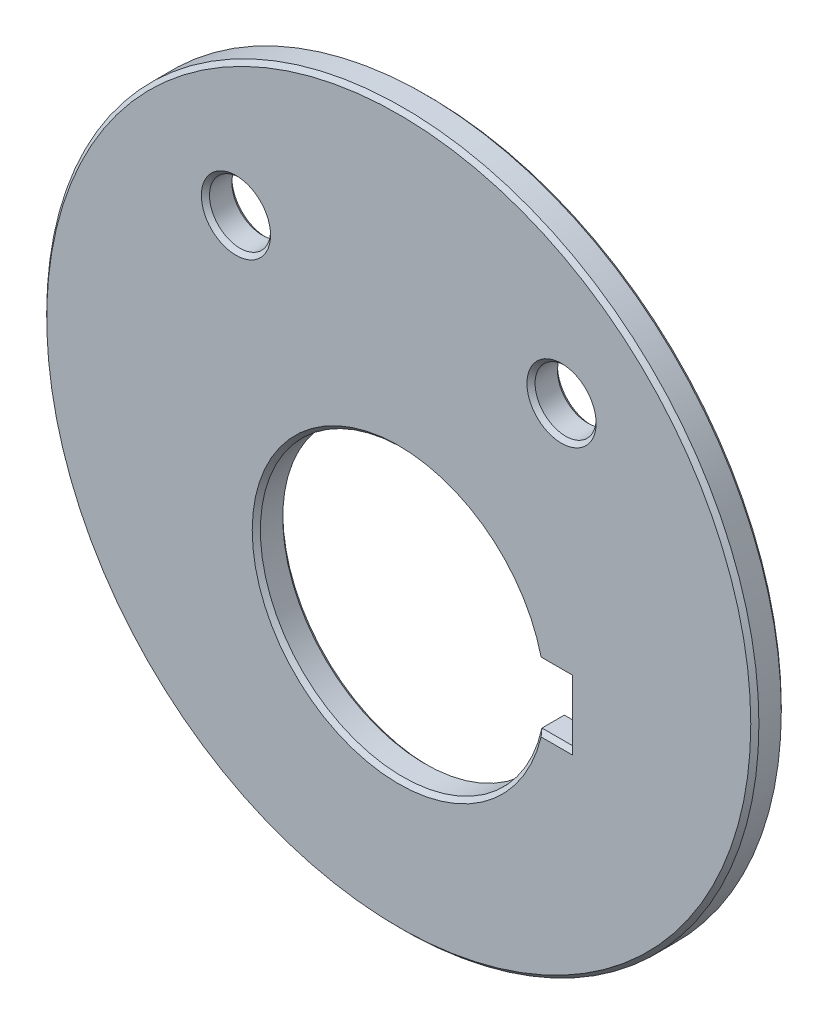
ISO-10303-21;
HEADER;
FILE_DESCRIPTION(('STEP AP214'),'2;1');
FILE_NAME('part.step','',(''),(''),'','','');
FILE_SCHEMA(('AUTOMOTIVE_DESIGN { 1 0 10303 214 1 1 1 1 }'));
ENDSEC;
DATA;
#1=APPLICATION_CONTEXT('core data for automotive mechanical design processes');
#2=APPLICATION_PROTOCOL_DEFINITION('international standard','automotive_design',2000,#1);
#3=PRODUCT_CONTEXT('',#1,'mechanical');
#4=PRODUCT('Part','Part','',(#3));
#5=PRODUCT_RELATED_PRODUCT_CATEGORY('part','',(#4));
#6=PRODUCT_DEFINITION_FORMATION('','',#4);
#7=PRODUCT_DEFINITION_CONTEXT('part definition',#1,'design');
#8=PRODUCT_DEFINITION('design','',#6,#7);
#9=PRODUCT_DEFINITION_SHAPE('','',#8);
#10=(LENGTH_UNIT() NAMED_UNIT(*) SI_UNIT(.MILLI.,.METRE.));
#11=(NAMED_UNIT(*) PLANE_ANGLE_UNIT() SI_UNIT($,.RADIAN.));
#12=(NAMED_UNIT(*) SI_UNIT($,.STERADIAN.) SOLID_ANGLE_UNIT());
#13=UNCERTAINTY_MEASURE_WITH_UNIT(LENGTH_MEASURE(1.E-05),#10,'distance_accuracy_value','');
#14=(GEOMETRIC_REPRESENTATION_CONTEXT(3) GLOBAL_UNCERTAINTY_ASSIGNED_CONTEXT((#13)) GLOBAL_UNIT_ASSIGNED_CONTEXT((#10,
#11,#12)) REPRESENTATION_CONTEXT('',''));
#15=CARTESIAN_POINT('',(0.,0.,0.));
#16=DIRECTION('',(0.,0.,1.));
#17=DIRECTION('',(1.,0.,0.));
#18=AXIS2_PLACEMENT_3D('',#15,#16,#17);
#19=CARTESIAN_POINT('',(0.,0.,1.5));
#20=DIRECTION('',(0.,0.,1.));
#21=DIRECTION('',(1.,0.,0.));
#22=AXIS2_PLACEMENT_3D('',#19,#20,#21);
#23=PLANE('',#22);
#24=CARTESIAN_POINT('',(-8.,9.,1.5));
#25=DIRECTION('',(0.,0.,1.));
#26=DIRECTION('',(1.,0.,0.));
#27=AXIS2_PLACEMENT_3D('',#24,#25,#26);
#28=CIRCLE('',#27,1.7);
#29=CARTESIAN_POINT('',(-6.3,9.,1.5));
#30=VERTEX_POINT('',#29);
#31=EDGE_CURVE('E11',#30,#30,#28,.F.);
#32=ORIENTED_EDGE('',*,*,#31,.T.);
#33=EDGE_LOOP('',(#32));
#34=FACE_BOUND('',#33,.T.);
#35=DIRECTION('',(-1.,0.,0.));
#36=VECTOR('',#35,1.);
#37=CARTESIAN_POINT('',(0.,-5.70000000000001,1.5));
#38=LINE('',#37,#36);
#39=CARTESIAN_POINT('',(8.53739716558868,-5.70000000000001,1.5));
#40=VERTEX_POINT('',#39);
#41=CARTESIAN_POINT('',(6.99642765988473,-5.70000000000001,1.5));
#42=VERTEX_POINT('',#41);
#43=EDGE_CURVE('E64',#40,#42,#38,.T.);
#44=ORIENTED_EDGE('',*,*,#43,.T.);
#45=CARTESIAN_POINT('',(0.,-4.,1.5));
#46=DIRECTION('',(0.,0.,1.));
#47=DIRECTION('',(1.,0.,0.));
#48=AXIS2_PLACEMENT_3D('',#45,#46,#47);
#49=CIRCLE('',#48,7.20000000000001);
#50=CARTESIAN_POINT('',(6.99642765988473,-2.29999999999999,1.5));
#51=VERTEX_POINT('',#50);
#52=EDGE_CURVE('E56',#42,#51,#49,.F.);
#53=ORIENTED_EDGE('',*,*,#52,.T.);
#54=DIRECTION('',(1.,0.,0.));
#55=VECTOR('',#54,1.);
#56=CARTESIAN_POINT('',(0.,-2.29999999999999,1.5));
#57=LINE('',#56,#55);
#58=CARTESIAN_POINT('',(8.53739716558868,-2.29999999999999,1.5));
#59=VERTEX_POINT('',#58);
#60=EDGE_CURVE('E213',#51,#59,#57,.T.);
#61=ORIENTED_EDGE('',*,*,#60,.T.);
#62=DIRECTION('',(0.,-1.,0.));
#63=VECTOR('',#62,1.);
#64=CARTESIAN_POINT('',(8.53739716558868,0.,1.5));
#65=LINE('',#64,#63);
#66=EDGE_CURVE('E69',#59,#40,#65,.T.);
#67=ORIENTED_EDGE('',*,*,#66,.T.);
#68=EDGE_LOOP('',(#44,#53,#61,#67));
#69=FACE_BOUND('',#68,.T.);
#70=CARTESIAN_POINT('',(0.,0.,1.5));
#71=DIRECTION('',(0.,0.,1.));
#72=DIRECTION('',(1.,0.,0.));
#73=AXIS2_PLACEMENT_3D('',#70,#71,#72);
#74=CIRCLE('',#73,17.3);
#75=CARTESIAN_POINT('',(17.3,0.,1.5));
#76=VERTEX_POINT('',#75);
#77=EDGE_CURVE('E209',#76,#76,#74,.T.);
#78=ORIENTED_EDGE('',*,*,#77,.T.);
#79=EDGE_LOOP('',(#78));
#80=FACE_BOUND('',#79,.T.);
#81=CARTESIAN_POINT('',(8.,9.,1.5));
#82=DIRECTION('',(0.,0.,1.));
#83=DIRECTION('',(1.,0.,0.));
#84=AXIS2_PLACEMENT_3D('',#81,#82,#83);
#85=CIRCLE('',#84,1.7);
#86=CARTESIAN_POINT('',(9.7,9.,1.5));
#87=VERTEX_POINT('',#86);
#88=EDGE_CURVE('E205',#87,#87,#85,.F.);
#89=ORIENTED_EDGE('',*,*,#88,.T.);
#90=EDGE_LOOP('',(#89));
#91=FACE_BOUND('',#90,.T.);
#92=ADVANCED_FACE('F45',(#34,#69,#80,#91),#23,.T.);
#93=CARTESIAN_POINT('',(0.,0.,0.));
#94=DIRECTION('',(0.,0.,1.));
#95=DIRECTION('',(1.,0.,0.));
#96=AXIS2_PLACEMENT_3D('',#93,#94,#95);
#97=PLANE('',#96);
#98=CARTESIAN_POINT('',(-8.,9.,0.));
#99=DIRECTION('',(0.,0.,1.));
#100=DIRECTION('',(1.,0.,0.));
#101=AXIS2_PLACEMENT_3D('',#98,#99,#100);
#102=CIRCLE('',#101,1.69999999999999);
#103=CARTESIAN_POINT('',(-6.30000000000001,9.,0.));
#104=VERTEX_POINT('',#103);
#105=EDGE_CURVE('E149',#104,#104,#102,.T.);
#106=ORIENTED_EDGE('',*,*,#105,.T.);
#107=EDGE_LOOP('',(#106));
#108=FACE_BOUND('',#107,.T.);
#109=CARTESIAN_POINT('',(8.,9.,0.));
#110=DIRECTION('',(0.,0.,1.));
#111=DIRECTION('',(1.,0.,0.));
#112=AXIS2_PLACEMENT_3D('',#109,#110,#111);
#113=CIRCLE('',#112,1.7);
#114=CARTESIAN_POINT('',(9.7,9.,0.));
#115=VERTEX_POINT('',#114);
#116=EDGE_CURVE('E144',#115,#115,#113,.T.);
#117=ORIENTED_EDGE('',*,*,#116,.T.);
#118=EDGE_LOOP('',(#117));
#119=FACE_BOUND('',#118,.T.);
#120=CARTESIAN_POINT('',(0.,-4.,0.));
#121=DIRECTION('',(0.,0.,1.));
#122=DIRECTION('',(1.,0.,0.));
#123=AXIS2_PLACEMENT_3D('',#120,#121,#122);
#124=CIRCLE('',#123,7.19999999999999);
#125=CARTESIAN_POINT('',(6.99642765988471,-2.30000000000001,0.));
#126=VERTEX_POINT('',#125);
#127=CARTESIAN_POINT('',(6.99642765988471,-5.69999999999999,0.));
#128=VERTEX_POINT('',#127);
#129=EDGE_CURVE('E141',#126,#128,#124,.T.);
#130=ORIENTED_EDGE('',*,*,#129,.T.);
#131=DIRECTION('',(1.,0.,0.));
#132=VECTOR('',#131,1.);
#133=CARTESIAN_POINT('',(8.33739716558867,-5.69999999999999,0.));
#134=LINE('',#133,#132);
#135=CARTESIAN_POINT('',(8.53739716558866,-5.69999999999999,0.));
#136=VERTEX_POINT('',#135);
#137=EDGE_CURVE('E119',#128,#136,#134,.T.);
#138=ORIENTED_EDGE('',*,*,#137,.T.);
#139=DIRECTION('',(0.,1.,0.));
#140=VECTOR('',#139,1.);
#141=CARTESIAN_POINT('',(8.53739716558866,-2.5,0.));
#142=LINE('',#141,#140);
#143=CARTESIAN_POINT('',(8.53739716558866,-2.30000000000001,0.));
#144=VERTEX_POINT('',#143);
#145=EDGE_CURVE('E128',#136,#144,#142,.T.);
#146=ORIENTED_EDGE('',*,*,#145,.T.);
#147=DIRECTION('',(-1.,0.,0.));
#148=VECTOR('',#147,1.);
#149=CARTESIAN_POINT('',(6.83739716558867,-2.30000000000001,0.));
#150=LINE('',#149,#148);
#151=EDGE_CURVE('E135',#144,#126,#150,.T.);
#152=ORIENTED_EDGE('',*,*,#151,.T.);
#153=EDGE_LOOP('',(#130,#138,#146,#152));
#154=FACE_BOUND('',#153,.T.);
#155=CARTESIAN_POINT('',(0.,0.,0.));
#156=DIRECTION('',(0.,0.,1.));
#157=DIRECTION('',(1.,0.,0.));
#158=AXIS2_PLACEMENT_3D('',#155,#156,#157);
#159=CIRCLE('',#158,17.3);
#160=CARTESIAN_POINT('',(17.3,0.,0.));
#161=VERTEX_POINT('',#160);
#162=EDGE_CURVE('E136',#161,#161,#159,.F.);
#163=ORIENTED_EDGE('',*,*,#162,.T.);
#164=EDGE_LOOP('',(#163));
#165=FACE_BOUND('',#164,.T.);
#166=ADVANCED_FACE('F138',(#108,#119,#154,#165),#97,.F.);
#167=CARTESIAN_POINT('',(0.,0.,1.5));
#168=DIRECTION('',(0.,0.,-1.));
#169=DIRECTION('',(-1.,0.,0.));
#170=AXIS2_PLACEMENT_3D('',#167,#168,#169);
#171=CYLINDRICAL_SURFACE('',#170,17.5);
#172=CARTESIAN_POINT('',(0.,0.,0.199999999999999));
#173=DIRECTION('',(0.,0.,1.));
#174=DIRECTION('',(1.,0.,0.));
#175=AXIS2_PLACEMENT_3D('',#172,#173,#174);
#176=CIRCLE('',#175,17.5);
#177=CARTESIAN_POINT('',(17.5,0.,0.199999999999999));
#178=VERTEX_POINT('',#177);
#179=EDGE_CURVE('E201',#178,#178,#176,.T.);
#180=ORIENTED_EDGE('',*,*,#179,.T.);
#181=EDGE_LOOP('',(#180));
#182=FACE_BOUND('',#181,.T.);
#183=CARTESIAN_POINT('',(0.,0.,1.3));
#184=DIRECTION('',(0.,0.,1.));
#185=DIRECTION('',(1.,0.,0.));
#186=AXIS2_PLACEMENT_3D('',#183,#184,#185);
#187=CIRCLE('',#186,17.5);
#188=CARTESIAN_POINT('',(17.5,0.,1.3));
#189=VERTEX_POINT('',#188);
#190=EDGE_CURVE('E197',#189,#189,#187,.F.);
#191=ORIENTED_EDGE('',*,*,#190,.T.);
#192=EDGE_LOOP('',(#191));
#193=FACE_BOUND('',#192,.T.);
#194=ADVANCED_FACE('F328',(#182,#193),#171,.T.);
#195=CARTESIAN_POINT('',(8.33739716558867,-2.5,1.5));
#196=DIRECTION('',(-1.,0.,0.));
#197=DIRECTION('',(0.,0.,1.));
#198=AXIS2_PLACEMENT_3D('',#195,#196,#197);
#199=PLANE('',#198);
#200=DIRECTION('',(0.,0.,-1.));
#201=VECTOR('',#200,1.);
#202=CARTESIAN_POINT('',(8.33739716558867,-2.5,1.5));
#203=LINE('',#202,#201);
#204=CARTESIAN_POINT('',(8.33739716558867,-2.5,1.29999999999999));
#205=VERTEX_POINT('',#204);
#206=CARTESIAN_POINT('',(8.33739716558867,-2.5,0.199999999999999));
#207=VERTEX_POINT('',#206);
#208=EDGE_CURVE('E391',#205,#207,#203,.T.);
#209=ORIENTED_EDGE('',*,*,#208,.T.);
#210=DIRECTION('',(0.,-1.,0.));
#211=VECTOR('',#210,1.);
#212=CARTESIAN_POINT('',(8.33739716558867,-5.5,0.199999999999999));
#213=LINE('',#212,#211);
#214=CARTESIAN_POINT('',(8.33739716558867,-5.5,0.199999999999999));
#215=VERTEX_POINT('',#214);
#216=EDGE_CURVE('E194',#207,#215,#213,.T.);
#217=ORIENTED_EDGE('',*,*,#216,.T.);
#218=DIRECTION('',(0.,0.,-1.));
#219=VECTOR('',#218,1.);
#220=CARTESIAN_POINT('',(8.33739716558867,-5.5,1.5));
#221=LINE('',#220,#219);
#222=CARTESIAN_POINT('',(8.33739716558867,-5.5,1.29999999999999));
#223=VERTEX_POINT('',#222);
#224=EDGE_CURVE('E267',#223,#215,#221,.T.);
#225=ORIENTED_EDGE('',*,*,#224,.F.);
#226=DIRECTION('',(0.,1.,0.));
#227=VECTOR('',#226,1.);
#228=CARTESIAN_POINT('',(8.33739716558867,-2.5,1.29999999999999));
#229=LINE('',#228,#227);
#230=EDGE_CURVE('E191',#223,#205,#229,.T.);
#231=ORIENTED_EDGE('',*,*,#230,.T.);
#232=EDGE_LOOP('',(#209,#217,#225,#231));
#233=FACE_BOUND('',#232,.T.);
#234=ADVANCED_FACE('F332',(#233),#199,.T.);
#235=CARTESIAN_POINT('',(8.33739716558867,-2.5,1.5));
#236=DIRECTION('',(0.,-1.,0.));
#237=DIRECTION('',(1.,0.,0.));
#238=AXIS2_PLACEMENT_3D('',#235,#236,#237);
#239=PLANE('',#238);
#240=DIRECTION('',(0.,0.,-1.));
#241=VECTOR('',#240,1.);
#242=CARTESIAN_POINT('',(6.83739716558867,-2.5,1.5));
#243=LINE('',#242,#241);
#244=CARTESIAN_POINT('',(6.83739716558867,-2.5,1.29999999999999));
#245=VERTEX_POINT('',#244);
#246=CARTESIAN_POINT('',(6.83739716558867,-2.5,0.199999999999999));
#247=VERTEX_POINT('',#246);
#248=EDGE_CURVE('E384',#245,#247,#243,.T.);
#249=ORIENTED_EDGE('',*,*,#248,.T.);
#250=DIRECTION('',(1.,0.,0.));
#251=VECTOR('',#250,1.);
#252=CARTESIAN_POINT('',(8.33739716558867,-2.5,0.199999999999999));
#253=LINE('',#252,#251);
#254=EDGE_CURVE('E188',#247,#207,#253,.T.);
#255=ORIENTED_EDGE('',*,*,#254,.T.);
#256=ORIENTED_EDGE('',*,*,#208,.F.);
#257=DIRECTION('',(-1.,0.,0.));
#258=VECTOR('',#257,1.);
#259=CARTESIAN_POINT('',(8.33739716558867,-2.5,1.29999999999999));
#260=LINE('',#259,#258);
#261=EDGE_CURVE('E185',#205,#245,#260,.T.);
#262=ORIENTED_EDGE('',*,*,#261,.T.);
#263=EDGE_LOOP('',(#249,#255,#256,#262));
#264=FACE_BOUND('',#263,.T.);
#265=ADVANCED_FACE('F374',(#264),#239,.T.);
#266=CARTESIAN_POINT('',(0.,-4.,1.5));
#267=DIRECTION('',(0.,0.,-1.));
#268=DIRECTION('',(-1.,0.,0.));
#269=AXIS2_PLACEMENT_3D('',#266,#267,#268);
#270=CYLINDRICAL_SURFACE('',#269,7.);
#271=DIRECTION('',(0.,0.,-1.));
#272=VECTOR('',#271,1.);
#273=CARTESIAN_POINT('',(6.83739716558867,-5.5,1.5));
#274=LINE('',#273,#272);
#275=CARTESIAN_POINT('',(6.83739716558867,-5.5,1.29999999999999));
#276=VERTEX_POINT('',#275);
#277=CARTESIAN_POINT('',(6.83739716558867,-5.5,0.199999999999999));
#278=VERTEX_POINT('',#277);
#279=EDGE_CURVE('E392',#276,#278,#274,.T.);
#280=ORIENTED_EDGE('',*,*,#279,.T.);
#281=CARTESIAN_POINT('',(0.,-4.,0.199999999999999));
#282=DIRECTION('',(0.,0.,1.));
#283=DIRECTION('',(1.,0.,0.));
#284=AXIS2_PLACEMENT_3D('',#281,#282,#283);
#285=CIRCLE('',#284,7.);
#286=EDGE_CURVE('E182',#278,#247,#285,.F.);
#287=ORIENTED_EDGE('',*,*,#286,.T.);
#288=ORIENTED_EDGE('',*,*,#248,.F.);
#289=CARTESIAN_POINT('',(0.,-4.,1.29999999999999));
#290=DIRECTION('',(0.,0.,1.));
#291=DIRECTION('',(1.,0.,0.));
#292=AXIS2_PLACEMENT_3D('',#289,#290,#291);
#293=CIRCLE('',#292,7.);
#294=EDGE_CURVE('E178',#245,#276,#293,.T.);
#295=ORIENTED_EDGE('',*,*,#294,.T.);
#296=EDGE_LOOP('',(#280,#287,#288,#295));
#297=FACE_BOUND('',#296,.T.);
#298=ADVANCED_FACE('F369',(#297),#270,.F.);
#299=CARTESIAN_POINT('',(8.33739716558867,-5.5,1.5));
#300=DIRECTION('',(0.,1.,0.));
#301=DIRECTION('',(0.,0.,1.));
#302=AXIS2_PLACEMENT_3D('',#299,#300,#301);
#303=PLANE('',#302);
#304=ORIENTED_EDGE('',*,*,#224,.T.);
#305=DIRECTION('',(-1.,0.,0.));
#306=VECTOR('',#305,1.);
#307=CARTESIAN_POINT('',(6.83739716558867,-5.5,0.199999999999999));
#308=LINE('',#307,#306);
#309=EDGE_CURVE('E121',#215,#278,#308,.T.);
#310=ORIENTED_EDGE('',*,*,#309,.T.);
#311=ORIENTED_EDGE('',*,*,#279,.F.);
#312=DIRECTION('',(1.,0.,0.));
#313=VECTOR('',#312,1.);
#314=CARTESIAN_POINT('',(8.33739716558867,-5.5,1.29999999999999));
#315=LINE('',#314,#313);
#316=EDGE_CURVE('E173',#276,#223,#315,.T.);
#317=ORIENTED_EDGE('',*,*,#316,.T.);
#318=EDGE_LOOP('',(#304,#310,#311,#317));
#319=FACE_BOUND('',#318,.T.);
#320=ADVANCED_FACE('F359',(#319),#303,.T.);
#321=CARTESIAN_POINT('',(8.,9.,1.5));
#322=DIRECTION('',(0.,0.,-1.));
#323=DIRECTION('',(-1.,0.,0.));
#324=AXIS2_PLACEMENT_3D('',#321,#322,#323);
#325=CYLINDRICAL_SURFACE('',#324,1.5);
#326=CARTESIAN_POINT('',(8.,9.,0.199999999999998));
#327=DIRECTION('',(0.,0.,1.));
#328=DIRECTION('',(1.,0.,0.));
#329=AXIS2_PLACEMENT_3D('',#326,#327,#328);
#330=CIRCLE('',#329,1.5);
#331=CARTESIAN_POINT('',(9.5,9.,0.199999999999998));
#332=VERTEX_POINT('',#331);
#333=EDGE_CURVE('E169',#332,#332,#330,.F.);
#334=ORIENTED_EDGE('',*,*,#333,.T.);
#335=EDGE_LOOP('',(#334));
#336=FACE_BOUND('',#335,.T.);
#337=CARTESIAN_POINT('',(8.,9.,1.3));
#338=DIRECTION('',(0.,0.,1.));
#339=DIRECTION('',(1.,0.,0.));
#340=AXIS2_PLACEMENT_3D('',#337,#338,#339);
#341=CIRCLE('',#340,1.5);
#342=CARTESIAN_POINT('',(9.5,9.,1.3));
#343=VERTEX_POINT('',#342);
#344=EDGE_CURVE('E165',#343,#343,#341,.T.);
#345=ORIENTED_EDGE('',*,*,#344,.T.);
#346=EDGE_LOOP('',(#345));
#347=FACE_BOUND('',#346,.T.);
#348=ADVANCED_FACE('F356',(#336,#347),#325,.F.);
#349=CARTESIAN_POINT('',(-8.,9.,1.5));
#350=DIRECTION('',(0.,0.,-1.));
#351=DIRECTION('',(-1.,0.,0.));
#352=AXIS2_PLACEMENT_3D('',#349,#350,#351);
#353=CYLINDRICAL_SURFACE('',#352,1.5);
#354=CARTESIAN_POINT('',(-8.,9.,0.199999999999992));
#355=DIRECTION('',(0.,0.,1.));
#356=DIRECTION('',(1.,0.,0.));
#357=AXIS2_PLACEMENT_3D('',#354,#355,#356);
#358=CIRCLE('',#357,1.5);
#359=CARTESIAN_POINT('',(-6.5,9.,0.199999999999992));
#360=VERTEX_POINT('',#359);
#361=EDGE_CURVE('E161',#360,#360,#358,.F.);
#362=ORIENTED_EDGE('',*,*,#361,.T.);
#363=EDGE_LOOP('',(#362));
#364=FACE_BOUND('',#363,.T.);
#365=CARTESIAN_POINT('',(-8.,9.,1.3));
#366=DIRECTION('',(0.,0.,1.));
#367=DIRECTION('',(1.,0.,0.));
#368=AXIS2_PLACEMENT_3D('',#365,#366,#367);
#369=CIRCLE('',#368,1.5);
#370=CARTESIAN_POINT('',(-6.5,9.,1.3));
#371=VERTEX_POINT('',#370);
#372=EDGE_CURVE('E157',#371,#371,#369,.T.);
#373=ORIENTED_EDGE('',*,*,#372,.T.);
#374=EDGE_LOOP('',(#373));
#375=FACE_BOUND('',#374,.T.);
#376=ADVANCED_FACE('F343',(#364,#375),#353,.F.);
#377=CARTESIAN_POINT('',(-8.,9.,0.));
#378=DIRECTION('',(0.,0.,-1.));
#379=DIRECTION('',(-1.,0.,0.));
#380=AXIS2_PLACEMENT_3D('',#377,#378,#379);
#381=CONICAL_SURFACE('',#380,1.69999999999999,0.785398163397435);
#382=ORIENTED_EDGE('',*,*,#361,.F.);
#383=EDGE_LOOP('',(#382));
#384=FACE_BOUND('',#383,.T.);
#385=ORIENTED_EDGE('',*,*,#105,.F.);
#386=EDGE_LOOP('',(#385));
#387=FACE_BOUND('',#386,.T.);
#388=ADVANCED_FACE('F339',(#384,#387),#381,.F.);
#389=CARTESIAN_POINT('',(8.,9.,0.));
#390=DIRECTION('',(0.,0.,-1.));
#391=DIRECTION('',(-1.,0.,0.));
#392=AXIS2_PLACEMENT_3D('',#389,#390,#391);
#393=CONICAL_SURFACE('',#392,1.7,0.785398163397451);
#394=ORIENTED_EDGE('',*,*,#333,.F.);
#395=EDGE_LOOP('',(#394));
#396=FACE_BOUND('',#395,.T.);
#397=ORIENTED_EDGE('',*,*,#116,.F.);
#398=EDGE_LOOP('',(#397));
#399=FACE_BOUND('',#398,.T.);
#400=ADVANCED_FACE('F255',(#396,#399),#393,.F.);
#401=CARTESIAN_POINT('',(0.,-2.3,0.));
#402=DIRECTION('',(0.,-0.70710678118656,-0.707106781186535));
#403=DIRECTION('',(1.,0.,0.));
#404=AXIS2_PLACEMENT_3D('',#401,#402,#403);
#405=PLANE('',#404);
#406=DIRECTION('',(0.577350269189619,0.577350269189619,-0.577350269189639));
#407=VECTOR('',#406,1.);
#408=CARTESIAN_POINT('',(5.69159811039251,-5.14579905519616,2.84579905519625));
#409=LINE('',#408,#407);
#410=EDGE_CURVE('E131',#207,#144,#409,.T.);
#411=ORIENTED_EDGE('',*,*,#410,.F.);
#412=ORIENTED_EDGE('',*,*,#254,.F.);
#413=CARTESIAN_POINT('',(6.83739716558867,-2.5,0.199999999999999));
#414=CARTESIAN_POINT('',(6.86413375450554,-2.46675870443723,0.166758704437231));
#415=CARTESIAN_POINT('',(6.89075459127096,-2.43347138856984,0.133471388569838));
#416=CARTESIAN_POINT('',(6.94376475599699,-2.36680472188754,0.0668047218875383));
#417=CARTESIAN_POINT('',(6.97015408399691,-2.33342537108827,0.0334253710882654));
#418=CARTESIAN_POINT('',(6.99642765988472,-2.30000000000001,0.));
#419=B_SPLINE_CURVE_WITH_KNOTS('',3,(#413,#414,#415,#416,#417,#418),.UNSPECIFIED.,.F.,.F.,(4,2,
4),(0.,0.162243143795426,0.324486260033506),.UNSPECIFIED.);
#420=EDGE_CURVE('E259',#126,#247,#419,.F.);
#421=ORIENTED_EDGE('',*,*,#420,.F.);
#422=ORIENTED_EDGE('',*,*,#151,.F.);
#423=EDGE_LOOP('',(#411,#412,#421,#422));
#424=FACE_BOUND('',#423,.T.);
#425=ADVANCED_FACE('F248',(#424),#405,.T.);
#426=CARTESIAN_POINT('',(0.,-4.,0.));
#427=DIRECTION('',(0.,0.,-1.));
#428=DIRECTION('',(-1.,0.,0.));
#429=AXIS2_PLACEMENT_3D('',#426,#427,#428);
#430=CONICAL_SURFACE('',#429,7.19999999999999,0.785398163397431);
#431=ORIENTED_EDGE('',*,*,#420,.T.);
#432=ORIENTED_EDGE('',*,*,#286,.F.);
#433=CARTESIAN_POINT('',(6.83739716558867,-5.5,0.199999999999999));
#434=CARTESIAN_POINT('',(6.86413375450554,-5.53324129556277,0.166758704437231));
#435=CARTESIAN_POINT('',(6.89075459127096,-5.56652861143016,0.133471388569837));
#436=CARTESIAN_POINT('',(6.94376475599699,-5.63319527811246,0.066804721887538));
#437=CARTESIAN_POINT('',(6.97015408399691,-5.66657462891173,0.0334253710882652));
#438=CARTESIAN_POINT('',(6.99642765988472,-5.69999999999999,0.));
#439=B_SPLINE_CURVE_WITH_KNOTS('',3,(#433,#434,#435,#436,#437,#438),.UNSPECIFIED.,.F.,.F.,(4,2,
4),(0.,0.162243143795426,0.324486260033506),.UNSPECIFIED.);
#440=EDGE_CURVE('E125',#128,#278,#439,.F.);
#441=ORIENTED_EDGE('',*,*,#440,.F.);
#442=ORIENTED_EDGE('',*,*,#129,.F.);
#443=EDGE_LOOP('',(#431,#432,#441,#442));
#444=FACE_BOUND('',#443,.T.);
#445=ADVANCED_FACE('F232',(#444),#430,.F.);
#446=CARTESIAN_POINT('',(8.53739716558866,0.,0.));
#447=DIRECTION('',(-0.70710678118656,0.,-0.707106781186535));
#448=DIRECTION('',(0.,-1.,0.));
#449=AXIS2_PLACEMENT_3D('',#446,#447,#448);
#450=PLANE('',#449);
#451=ORIENTED_EDGE('',*,*,#410,.T.);
#452=ORIENTED_EDGE('',*,*,#145,.F.);
#453=DIRECTION('',(-0.577350269189619,0.577350269189619,0.577350269189639));
#454=VECTOR('',#453,1.);
#455=CARTESIAN_POINT('',(5.69159811039251,-2.85420094480384,2.84579905519625));
#456=LINE('',#455,#454);
#457=EDGE_CURVE('E115',#215,#136,#456,.F.);
#458=ORIENTED_EDGE('',*,*,#457,.F.);
#459=ORIENTED_EDGE('',*,*,#216,.F.);
#460=EDGE_LOOP('',(#451,#452,#458,#459));
#461=FACE_BOUND('',#460,.T.);
#462=ADVANCED_FACE('F129',(#461),#450,.T.);
#463=CARTESIAN_POINT('',(0.,-5.69999999999999,0.));
#464=DIRECTION('',(0.,0.70710678118656,-0.707106781186535));
#465=DIRECTION('',(-1.,0.,0.));
#466=AXIS2_PLACEMENT_3D('',#463,#464,#465);
#467=PLANE('',#466);
#468=ORIENTED_EDGE('',*,*,#440,.T.);
#469=ORIENTED_EDGE('',*,*,#309,.F.);
#470=ORIENTED_EDGE('',*,*,#457,.T.);
#471=ORIENTED_EDGE('',*,*,#137,.F.);
#472=EDGE_LOOP('',(#468,#469,#470,#471));
#473=FACE_BOUND('',#472,.T.);
#474=ADVANCED_FACE('F117',(#473),#467,.T.);
#475=CARTESIAN_POINT('',(0.,0.,0.199999999999999));
#476=DIRECTION('',(0.,0.,1.));
#477=DIRECTION('',(1.,0.,0.));
#478=AXIS2_PLACEMENT_3D('',#475,#476,#477);
#479=CONICAL_SURFACE('',#478,17.5,0.785398163397457);
#480=ORIENTED_EDGE('',*,*,#162,.F.);
#481=EDGE_LOOP('',(#480));
#482=FACE_BOUND('',#481,.T.);
#483=ORIENTED_EDGE('',*,*,#179,.F.);
#484=EDGE_LOOP('',(#483));
#485=FACE_BOUND('',#484,.T.);
#486=ADVANCED_FACE('F242',(#482,#485),#479,.T.);
#487=CARTESIAN_POINT('',(-8.,9.,1.3));
#488=DIRECTION('',(0.,0.,1.));
#489=DIRECTION('',(1.,0.,0.));
#490=AXIS2_PLACEMENT_3D('',#487,#488,#489);
#491=CONICAL_SURFACE('',#490,1.5,0.785398163397454);
#492=ORIENTED_EDGE('',*,*,#31,.F.);
#493=EDGE_LOOP('',(#492));
#494=FACE_BOUND('',#493,.T.);
#495=ORIENTED_EDGE('',*,*,#372,.F.);
#496=EDGE_LOOP('',(#495));
#497=FACE_BOUND('',#496,.T.);
#498=ADVANCED_FACE('F309',(#494,#497),#491,.F.);
#499=CARTESIAN_POINT('',(8.33739716558867,-2.5,1.29999999999999));
#500=DIRECTION('',(0.707106781186548,0.,-0.707106781186548));
#501=DIRECTION('',(0.,1.,0.));
#502=AXIS2_PLACEMENT_3D('',#499,#500,#501);
#503=PLANE('',#502);
#504=DIRECTION('',(0.577350269189626,-0.577350269189626,0.577350269189626));
#505=VECTOR('',#504,1.);
#506=CARTESIAN_POINT('',(8.33739716558867,-5.5,1.29999999999999));
#507=LINE('',#506,#505);
#508=EDGE_CURVE('E609',#40,#223,#507,.F.);
#509=ORIENTED_EDGE('',*,*,#508,.F.);
#510=ORIENTED_EDGE('',*,*,#66,.F.);
#511=DIRECTION('',(0.577350269189626,0.577350269189625,0.577350269189626));
#512=VECTOR('',#511,1.);
#513=CARTESIAN_POINT('',(8.33739716558867,-2.5,1.29999999999999));
#514=LINE('',#513,#512);
#515=EDGE_CURVE('E50',#205,#59,#514,.T.);
#516=ORIENTED_EDGE('',*,*,#515,.F.);
#517=ORIENTED_EDGE('',*,*,#230,.F.);
#518=EDGE_LOOP('',(#509,#510,#516,#517));
#519=FACE_BOUND('',#518,.T.);
#520=ADVANCED_FACE('F303',(#519),#503,.F.);
#521=CARTESIAN_POINT('',(8.33739716558867,-2.5,1.29999999999999));
#522=DIRECTION('',(0.,0.707106781186548,-0.707106781186548));
#523=DIRECTION('',(-1.,0.,0.));
#524=AXIS2_PLACEMENT_3D('',#521,#522,#523);
#525=PLANE('',#524);
#526=ORIENTED_EDGE('',*,*,#515,.T.);
#527=ORIENTED_EDGE('',*,*,#60,.F.);
#528=CARTESIAN_POINT('',(6.99642765988473,-2.29999999999999,1.5));
#529=CARTESIAN_POINT('',(6.97015408399692,-2.33342537108826,1.46657462891173));
#530=CARTESIAN_POINT('',(6.943764755997,-2.36680472188753,1.43319527811246));
#531=CARTESIAN_POINT('',(6.89075459127096,-2.43347138856984,1.36652861143016));
#532=CARTESIAN_POINT('',(6.86413375450554,-2.46675870443723,1.33324129556276));
#533=CARTESIAN_POINT('',(6.83739716558867,-2.5,1.29999999999999));
#534=B_SPLINE_CURVE_WITH_KNOTS('',3,(#528,#529,#530,#531,#532,#533),.UNSPECIFIED.,.F.,.F.,(4,2,
4),(0.,0.16224311623809,0.324486260033525),.UNSPECIFIED.);
#535=EDGE_CURVE('E277',#245,#51,#534,.F.);
#536=ORIENTED_EDGE('',*,*,#535,.F.);
#537=ORIENTED_EDGE('',*,*,#261,.F.);
#538=EDGE_LOOP('',(#526,#527,#536,#537));
#539=FACE_BOUND('',#538,.T.);
#540=ADVANCED_FACE('F295',(#539),#525,.F.);
#541=CARTESIAN_POINT('',(8.33739716558867,-5.5,1.29999999999999));
#542=DIRECTION('',(0.,-0.707106781186548,-0.707106781186548));
#543=DIRECTION('',(1.,0.,0.));
#544=AXIS2_PLACEMENT_3D('',#541,#542,#543);
#545=PLANE('',#544);
#546=ORIENTED_EDGE('',*,*,#508,.T.);
#547=ORIENTED_EDGE('',*,*,#316,.F.);
#548=CARTESIAN_POINT('',(6.83739716558867,-5.5,1.29999999999999));
#549=CARTESIAN_POINT('',(6.86413375450554,-5.53324129556277,1.33324129556276));
#550=CARTESIAN_POINT('',(6.89075459127097,-5.56652861143016,1.36652861143016));
#551=CARTESIAN_POINT('',(6.943764755997,-5.63319527811247,1.43319527811246));
#552=CARTESIAN_POINT('',(6.97015408399692,-5.66657462891174,1.46657462891173));
#553=CARTESIAN_POINT('',(6.99642765988473,-5.70000000000001,1.5));
#554=B_SPLINE_CURVE_WITH_KNOTS('',3,(#548,#549,#550,#551,#552,#553),.UNSPECIFIED.,.F.,.F.,(4,2,
4),(0.,0.162243143795435,0.324486260033524),.UNSPECIFIED.);
#555=EDGE_CURVE('E268',#42,#276,#554,.F.);
#556=ORIENTED_EDGE('',*,*,#555,.F.);
#557=ORIENTED_EDGE('',*,*,#43,.F.);
#558=EDGE_LOOP('',(#546,#547,#556,#557));
#559=FACE_BOUND('',#558,.T.);
#560=ADVANCED_FACE('F284',(#559),#545,.F.);
#561=CARTESIAN_POINT('',(0.,-4.,1.29999999999999));
#562=DIRECTION('',(0.,0.,1.));
#563=DIRECTION('',(1.,0.,0.));
#564=AXIS2_PLACEMENT_3D('',#561,#562,#563);
#565=CONICAL_SURFACE('',#564,7.,0.785398163397448);
#566=ORIENTED_EDGE('',*,*,#535,.T.);
#567=ORIENTED_EDGE('',*,*,#52,.F.);
#568=ORIENTED_EDGE('',*,*,#555,.T.);
#569=ORIENTED_EDGE('',*,*,#294,.F.);
#570=EDGE_LOOP('',(#566,#567,#568,#569));
#571=FACE_BOUND('',#570,.T.);
#572=ADVANCED_FACE('F287',(#571),#565,.F.);
#573=CARTESIAN_POINT('',(0.,0.,1.5));
#574=DIRECTION('',(0.,0.,-1.));
#575=DIRECTION('',(-1.,0.,0.));
#576=AXIS2_PLACEMENT_3D('',#573,#574,#575);
#577=CONICAL_SURFACE('',#576,17.3,0.78539816339744);
#578=ORIENTED_EDGE('',*,*,#190,.F.);
#579=EDGE_LOOP('',(#578));
#580=FACE_BOUND('',#579,.T.);
#581=ORIENTED_EDGE('',*,*,#77,.F.);
#582=EDGE_LOOP('',(#581));
#583=FACE_BOUND('',#582,.T.);
#584=ADVANCED_FACE('F293',(#580,#583),#577,.T.);
#585=CARTESIAN_POINT('',(8.,9.,1.3));
#586=DIRECTION('',(0.,0.,1.));
#587=DIRECTION('',(1.,0.,0.));
#588=AXIS2_PLACEMENT_3D('',#585,#586,#587);
#589=CONICAL_SURFACE('',#588,1.5,0.785398163397454);
#590=ORIENTED_EDGE('',*,*,#88,.F.);
#591=EDGE_LOOP('',(#590));
#592=FACE_BOUND('',#591,.T.);
#593=ORIENTED_EDGE('',*,*,#344,.F.);
#594=EDGE_LOOP('',(#593));
#595=FACE_BOUND('',#594,.T.);
#596=ADVANCED_FACE('F48',(#592,#595),#589,.F.);
#597=CLOSED_SHELL('',(#92,#166,#194,#234,#265,#298,#320,#348,#376,#388,#400,#425,#445,#462,#474,
#486,#498,#520,#540,#560,#572,#584,#596));
#598=MANIFOLD_SOLID_BREP('B2',#597);
#599=ADVANCED_BREP_SHAPE_REPRESENTATION('',(#18,#598),#14);
#600=SHAPE_DEFINITION_REPRESENTATION(#9,#599);
ENDSEC;
END-ISO-10303-21;
